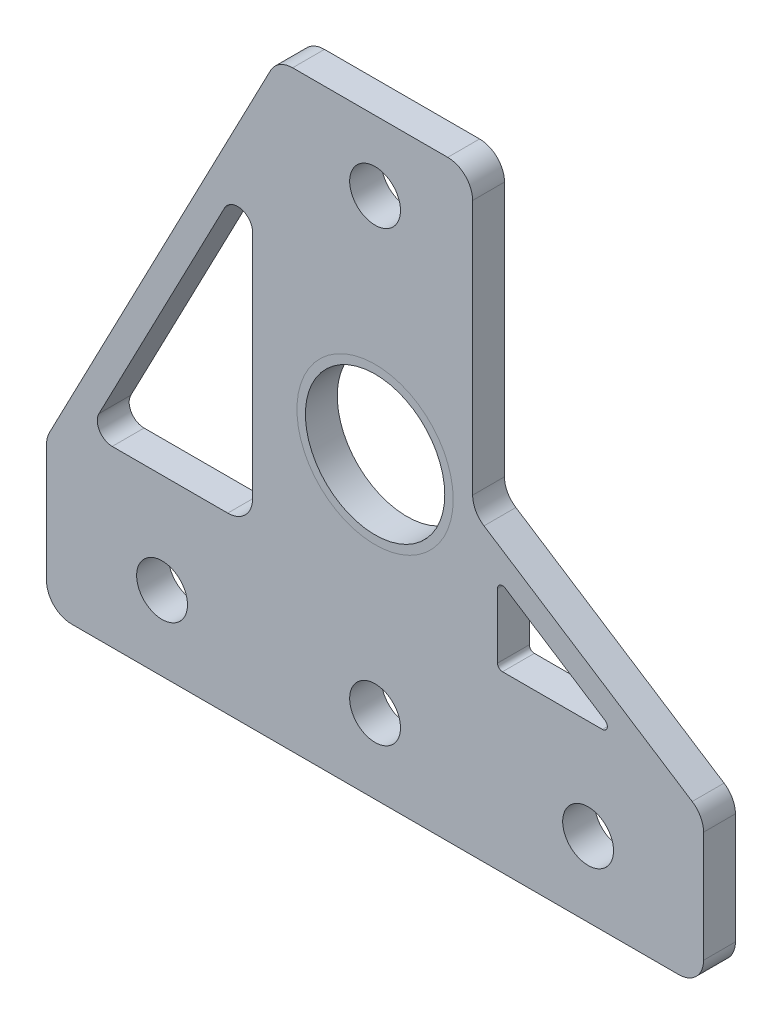
ISO-10303-21;
HEADER;
FILE_DESCRIPTION(('STEP AP214'),'2;1');
FILE_NAME('part.step','',(''),(''),'','','');
FILE_SCHEMA(('AUTOMOTIVE_DESIGN { 1 0 10303 214 1 1 1 1 }'));
ENDSEC;
DATA;
#1=APPLICATION_CONTEXT('core data for automotive mechanical design processes');
#2=APPLICATION_PROTOCOL_DEFINITION('international standard','automotive_design',2000,#1);
#3=PRODUCT_CONTEXT('',#1,'mechanical');
#4=PRODUCT('Part','Part','',(#3));
#5=PRODUCT_RELATED_PRODUCT_CATEGORY('part','',(#4));
#6=PRODUCT_DEFINITION_FORMATION('','',#4);
#7=PRODUCT_DEFINITION_CONTEXT('part definition',#1,'design');
#8=PRODUCT_DEFINITION('design','',#6,#7);
#9=PRODUCT_DEFINITION_SHAPE('','',#8);
#10=(LENGTH_UNIT() NAMED_UNIT(*) SI_UNIT(.MILLI.,.METRE.));
#11=(NAMED_UNIT(*) PLANE_ANGLE_UNIT() SI_UNIT($,.RADIAN.));
#12=(NAMED_UNIT(*) SI_UNIT($,.STERADIAN.) SOLID_ANGLE_UNIT());
#13=UNCERTAINTY_MEASURE_WITH_UNIT(LENGTH_MEASURE(1.E-05),#10,'distance_accuracy_value','');
#14=(GEOMETRIC_REPRESENTATION_CONTEXT(3) GLOBAL_UNCERTAINTY_ASSIGNED_CONTEXT((#13)) GLOBAL_UNIT_ASSIGNED_CONTEXT((#10,
#11,#12)) REPRESENTATION_CONTEXT('',''));
#15=CARTESIAN_POINT('',(0.,0.,0.));
#16=DIRECTION('',(0.,0.,1.));
#17=DIRECTION('',(1.,0.,0.));
#18=AXIS2_PLACEMENT_3D('',#15,#16,#17);
#19=CARTESIAN_POINT('',(0.,0.,0.));
#20=DIRECTION('',(0.,0.,-1.));
#21=DIRECTION('',(1.,0.,0.));
#22=AXIS2_PLACEMENT_3D('',#19,#20,#21);
#23=PLANE('',#22);
#24=DIRECTION('',(0.,-1.,0.));
#25=VECTOR('',#24,1.);
#26=CARTESIAN_POINT('',(-12.3,0.,0.));
#27=LINE('',#26,#25);
#28=CARTESIAN_POINT('',(-12.3,53.1750759692485,0.));
#29=VERTEX_POINT('',#28);
#30=CARTESIAN_POINT('',(-12.3,30.,0.));
#31=VERTEX_POINT('',#30);
#32=EDGE_CURVE('E459',#29,#31,#27,.T.);
#33=ORIENTED_EDGE('',*,*,#32,.T.);
#34=CARTESIAN_POINT('',(-14.8,30.,0.));
#35=DIRECTION('',(0.,0.,1.));
#36=DIRECTION('',(1.,0.,0.));
#37=AXIS2_PLACEMENT_3D('',#34,#35,#36);
#38=CIRCLE('',#37,2.5);
#39=CARTESIAN_POINT('',(-14.8,27.5,0.));
#40=VERTEX_POINT('',#39);
#41=EDGE_CURVE('E257',#40,#31,#38,.T.);
#42=ORIENTED_EDGE('',*,*,#41,.F.);
#43=DIRECTION('',(-1.,0.,0.));
#44=VECTOR('',#43,1.);
#45=CARTESIAN_POINT('',(0.,27.5,0.));
#46=LINE('',#45,#44);
#47=CARTESIAN_POINT('',(-26.4036351120577,27.5,0.));
#48=VERTEX_POINT('',#47);
#49=EDGE_CURVE('E244',#40,#48,#46,.T.);
#50=ORIENTED_EDGE('',*,*,#49,.T.);
#51=CARTESIAN_POINT('',(-26.4036351120577,29.,0.));
#52=DIRECTION('',(0.,0.,1.));
#53=DIRECTION('',(1.,0.,0.));
#54=AXIS2_PLACEMENT_3D('',#51,#52,#53);
#55=CIRCLE('',#54,1.5);
#56=CARTESIAN_POINT('',(-27.7337254989583,29.6934403814853,0.));
#57=VERTEX_POINT('',#56);
#58=EDGE_CURVE('E221',#57,#48,#55,.T.);
#59=ORIENTED_EDGE('',*,*,#58,.F.);
#60=DIRECTION('',(0.462293587656858,0.886726924600438,0.));
#61=VECTOR('',#60,1.);
#62=CARTESIAN_POINT('',(-33.9787800504102,17.7147797116745,0.));
#63=LINE('',#62,#61);
#64=CARTESIAN_POINT('',(-15.1300903869006,53.8685163507338,0.));
#65=VERTEX_POINT('',#64);
#66=EDGE_CURVE('E232',#57,#65,#63,.T.);
#67=ORIENTED_EDGE('',*,*,#66,.T.);
#68=CARTESIAN_POINT('',(-13.8,53.1750759692485,0.));
#69=DIRECTION('',(0.,0.,1.));
#70=DIRECTION('',(1.,0.,0.));
#71=AXIS2_PLACEMENT_3D('',#68,#69,#70);
#72=CIRCLE('',#71,1.5);
#73=EDGE_CURVE('E249',#29,#65,#72,.T.);
#74=ORIENTED_EDGE('',*,*,#73,.F.);
#75=EDGE_LOOP('',(#33,#42,#50,#59,#67,#74));
#76=FACE_BOUND('',#75,.T.);
#77=DIRECTION('',(0.,1.,0.));
#78=VECTOR('',#77,1.);
#79=CARTESIAN_POINT('',(12.3,0.,0.));
#80=LINE('',#79,#78);
#81=CARTESIAN_POINT('',(12.3,28.,0.));
#82=VERTEX_POINT('',#81);
#83=CARTESIAN_POINT('',(12.3,34.487913976209,0.));
#84=VERTEX_POINT('',#83);
#85=EDGE_CURVE('E369',#82,#84,#80,.T.);
#86=ORIENTED_EDGE('',*,*,#85,.T.);
#87=CARTESIAN_POINT('',(12.8,34.487913976209,0.));
#88=DIRECTION('',(0.,0.,1.));
#89=DIRECTION('',(1.,0.,0.));
#90=AXIS2_PLACEMENT_3D('',#87,#88,#89);
#91=CIRCLE('',#90,0.5);
#92=CARTESIAN_POINT('',(13.0714755376813,34.907796141156,0.));
#93=VERTEX_POINT('',#92);
#94=EDGE_CURVE('E287',#93,#84,#91,.T.);
#95=ORIENTED_EDGE('',*,*,#94,.F.);
#96=DIRECTION('',(-0.839764329894162,0.542951075362604,0.));
#97=VECTOR('',#96,1.);
#98=CARTESIAN_POINT('',(19.7696596786078,30.5770736362467,0.));
#99=LINE('',#98,#97);
#100=CARTESIAN_POINT('',(23.1061158208845,28.4198821649471,0.));
#101=VERTEX_POINT('',#100);
#102=EDGE_CURVE('E368',#101,#93,#99,.T.);
#103=ORIENTED_EDGE('',*,*,#102,.F.);
#104=CARTESIAN_POINT('',(22.8346402832032,28.,0.));
#105=DIRECTION('',(0.,0.,1.));
#106=DIRECTION('',(1.,0.,0.));
#107=AXIS2_PLACEMENT_3D('',#104,#105,#106);
#108=CIRCLE('',#107,0.5);
#109=CARTESIAN_POINT('',(22.8346402832032,27.5,0.));
#110=VERTEX_POINT('',#109);
#111=EDGE_CURVE('E281',#110,#101,#108,.T.);
#112=ORIENTED_EDGE('',*,*,#111,.F.);
#113=DIRECTION('',(1.,0.,0.));
#114=VECTOR('',#113,1.);
#115=CARTESIAN_POINT('',(0.,27.5,0.));
#116=LINE('',#115,#114);
#117=CARTESIAN_POINT('',(12.8,27.5,0.));
#118=VERTEX_POINT('',#117);
#119=EDGE_CURVE('E375',#118,#110,#116,.T.);
#120=ORIENTED_EDGE('',*,*,#119,.F.);
#121=CARTESIAN_POINT('',(12.8,28.,0.));
#122=DIRECTION('',(0.,0.,1.));
#123=DIRECTION('',(1.,0.,0.));
#124=AXIS2_PLACEMENT_3D('',#121,#122,#123);
#125=CIRCLE('',#124,0.5);
#126=EDGE_CURVE('E275',#82,#118,#125,.T.);
#127=ORIENTED_EDGE('',*,*,#126,.F.);
#128=EDGE_LOOP('',(#86,#95,#103,#112,#120,#127));
#129=FACE_BOUND('',#128,.T.);
#130=CARTESIAN_POINT('',(-21.4,17.5,0.));
#131=DIRECTION('',(0.,0.,1.));
#132=DIRECTION('',(1.,0.,0.));
#133=AXIS2_PLACEMENT_3D('',#130,#131,#132);
#134=CIRCLE('',#133,2.55270000000002);
#135=CARTESIAN_POINT('',(-18.8473,17.5,0.));
#136=VERTEX_POINT('',#135);
#137=EDGE_CURVE('E394',#136,#136,#134,.F.);
#138=ORIENTED_EDGE('',*,*,#137,.T.);
#139=EDGE_LOOP('',(#138));
#140=FACE_BOUND('',#139,.T.);
#141=CARTESIAN_POINT('',(21.4,17.5,0.));
#142=DIRECTION('',(0.,0.,1.));
#143=DIRECTION('',(1.,0.,0.));
#144=AXIS2_PLACEMENT_3D('',#141,#142,#143);
#145=CIRCLE('',#144,2.55270000000002);
#146=CARTESIAN_POINT('',(23.9527,17.5,0.));
#147=VERTEX_POINT('',#146);
#148=EDGE_CURVE('E397',#147,#147,#145,.F.);
#149=ORIENTED_EDGE('',*,*,#148,.T.);
#150=EDGE_LOOP('',(#149));
#151=FACE_BOUND('',#150,.T.);
#152=CARTESIAN_POINT('',(0.,17.5,0.));
#153=DIRECTION('',(0.,0.,1.));
#154=DIRECTION('',(1.,0.,0.));
#155=AXIS2_PLACEMENT_3D('',#152,#153,#154);
#156=CIRCLE('',#155,2.55270000000001);
#157=CARTESIAN_POINT('',(2.55269999999999,17.5,0.));
#158=VERTEX_POINT('',#157);
#159=EDGE_CURVE('E421',#158,#158,#156,.T.);
#160=ORIENTED_EDGE('',*,*,#159,.F.);
#161=EDGE_LOOP('',(#160));
#162=FACE_BOUND('',#161,.T.);
#163=CARTESIAN_POINT('',(0.,62.5,0.));
#164=DIRECTION('',(0.,0.,1.));
#165=DIRECTION('',(1.,0.,0.));
#166=AXIS2_PLACEMENT_3D('',#163,#164,#165);
#167=CIRCLE('',#166,2.55270000000001);
#168=CARTESIAN_POINT('',(2.5527,62.5,0.));
#169=VERTEX_POINT('',#168);
#170=EDGE_CURVE('E416',#169,#169,#167,.T.);
#171=ORIENTED_EDGE('',*,*,#170,.F.);
#172=EDGE_LOOP('',(#171));
#173=FACE_BOUND('',#172,.T.);
#174=DIRECTION('',(0.,-1.,0.));
#175=VECTOR('',#174,1.);
#176=CARTESIAN_POINT('',(-33.,0.,0.));
#177=LINE('',#176,#175);
#178=CARTESIAN_POINT('',(-33.,24.3874397221596,0.));
#179=VERTEX_POINT('',#178);
#180=CARTESIAN_POINT('',(-33.,12.5,0.));
#181=VERTEX_POINT('',#180);
#182=EDGE_CURVE('E398',#179,#181,#177,.T.);
#183=ORIENTED_EDGE('',*,*,#182,.T.);
#184=CARTESIAN_POINT('',(-30.5,12.5,0.));
#185=DIRECTION('',(0.,0.,1.));
#186=DIRECTION('',(1.,0.,0.));
#187=AXIS2_PLACEMENT_3D('',#184,#185,#186);
#188=CIRCLE('',#187,2.5);
#189=CARTESIAN_POINT('',(-30.5,10.,0.));
#190=VERTEX_POINT('',#189);
#191=EDGE_CURVE('E316',#190,#181,#188,.F.);
#192=ORIENTED_EDGE('',*,*,#191,.F.);
#193=DIRECTION('',(-1.,0.,0.));
#194=VECTOR('',#193,1.);
#195=CARTESIAN_POINT('',(0.,10.,0.));
#196=LINE('',#195,#194);
#197=CARTESIAN_POINT('',(30.5,10.,0.));
#198=VERTEX_POINT('',#197);
#199=EDGE_CURVE('E440',#198,#190,#196,.T.);
#200=ORIENTED_EDGE('',*,*,#199,.F.);
#201=CARTESIAN_POINT('',(30.5,12.5,0.));
#202=DIRECTION('',(0.,0.,1.));
#203=DIRECTION('',(1.,0.,0.));
#204=AXIS2_PLACEMENT_3D('',#201,#202,#203);
#205=CIRCLE('',#204,2.5);
#206=CARTESIAN_POINT('',(33.,12.5,0.));
#207=VERTEX_POINT('',#206);
#208=EDGE_CURVE('E314',#207,#198,#205,.F.);
#209=ORIENTED_EDGE('',*,*,#208,.F.);
#210=DIRECTION('',(0.,-1.,0.));
#211=VECTOR('',#210,1.);
#212=CARTESIAN_POINT('',(33.,0.,0.));
#213=LINE('',#212,#211);
#214=CARTESIAN_POINT('',(33.,23.6393536008638,0.));
#215=VERTEX_POINT('',#214);
#216=EDGE_CURVE('E408',#215,#207,#213,.T.);
#217=ORIENTED_EDGE('',*,*,#216,.F.);
#218=CARTESIAN_POINT('',(30.5,23.6393536008638,0.));
#219=DIRECTION('',(0.,0.,1.));
#220=DIRECTION('',(1.,0.,0.));
#221=AXIS2_PLACEMENT_3D('',#218,#219,#220);
#222=CIRCLE('',#221,2.5);
#223=CARTESIAN_POINT('',(31.8573776884065,25.7387644255992,0.));
#224=VERTEX_POINT('',#223);
#225=EDGE_CURVE('E324',#224,#215,#222,.F.);
#226=ORIENTED_EDGE('',*,*,#225,.F.);
#227=DIRECTION('',(-0.839764329894162,0.542951075362604,0.));
#228=VECTOR('',#227,1.);
#229=CARTESIAN_POINT('',(21.1270373670143,32.6764844609821,0.));
#230=LINE('',#229,#228);
#231=CARTESIAN_POINT('',(10.9426223115935,39.2612355744007,0.));
#232=VERTEX_POINT('',#231);
#233=EDGE_CURVE('E363',#224,#232,#230,.T.);
#234=ORIENTED_EDGE('',*,*,#233,.T.);
#235=CARTESIAN_POINT('',(12.3,41.3606463991361,0.));
#236=DIRECTION('',(0.,0.,1.));
#237=DIRECTION('',(1.,0.,0.));
#238=AXIS2_PLACEMENT_3D('',#235,#236,#237);
#239=CIRCLE('',#238,2.5);
#240=CARTESIAN_POINT('',(9.80000000000001,41.3606463991361,0.));
#241=VERTEX_POINT('',#240);
#242=EDGE_CURVE('E50',#241,#232,#239,.T.);
#243=ORIENTED_EDGE('',*,*,#242,.F.);
#244=DIRECTION('',(0.,1.,0.));
#245=VECTOR('',#244,1.);
#246=CARTESIAN_POINT('',(9.80000000000001,0.,0.));
#247=LINE('',#246,#245);
#248=CARTESIAN_POINT('',(9.80000000000001,67.,0.));
#249=VERTEX_POINT('',#248);
#250=EDGE_CURVE('E442',#241,#249,#247,.T.);
#251=ORIENTED_EDGE('',*,*,#250,.T.);
#252=CARTESIAN_POINT('',(7.30000000000001,67.,0.));
#253=DIRECTION('',(0.,0.,1.));
#254=DIRECTION('',(1.,0.,0.));
#255=AXIS2_PLACEMENT_3D('',#252,#253,#254);
#256=CIRCLE('',#255,2.5);
#257=CARTESIAN_POINT('',(7.30000000000001,69.5,0.));
#258=VERTEX_POINT('',#257);
#259=EDGE_CURVE('E321',#258,#249,#256,.F.);
#260=ORIENTED_EDGE('',*,*,#259,.F.);
#261=DIRECTION('',(-1.,0.,0.));
#262=VECTOR('',#261,1.);
#263=CARTESIAN_POINT('',(0.,69.5,0.));
#264=LINE('',#263,#262);
#265=CARTESIAN_POINT('',(-8.28401351806975,69.5,0.));
#266=VERTEX_POINT('',#265);
#267=EDGE_CURVE('E444',#258,#266,#264,.T.);
#268=ORIENTED_EDGE('',*,*,#267,.T.);
#269=CARTESIAN_POINT('',(-8.28401351806975,67.,0.));
#270=DIRECTION('',(0.,0.,1.));
#271=DIRECTION('',(1.,0.,0.));
#272=AXIS2_PLACEMENT_3D('',#269,#270,#271);
#273=CIRCLE('',#272,2.5);
#274=CARTESIAN_POINT('',(-10.5008308295708,68.1557339691422,0.));
#275=VERTEX_POINT('',#274);
#276=EDGE_CURVE('E318',#275,#266,#273,.F.);
#277=ORIENTED_EDGE('',*,*,#276,.F.);
#278=DIRECTION('',(0.462293587656858,0.886726924600438,0.));
#279=VECTOR('',#278,1.);
#280=CARTESIAN_POINT('',(-36.1955973619113,18.8705136808167,0.));
#281=LINE('',#280,#279);
#282=CARTESIAN_POINT('',(-32.7168173115011,25.5431736913018,0.));
#283=VERTEX_POINT('',#282);
#284=EDGE_CURVE('E386',#283,#275,#281,.T.);
#285=ORIENTED_EDGE('',*,*,#284,.F.);
#286=CARTESIAN_POINT('',(-30.5,24.3874397221596,0.));
#287=DIRECTION('',(0.,0.,1.));
#288=DIRECTION('',(1.,0.,0.));
#289=AXIS2_PLACEMENT_3D('',#286,#287,#288);
#290=CIRCLE('',#289,2.5);
#291=EDGE_CURVE('E327',#179,#283,#290,.F.);
#292=ORIENTED_EDGE('',*,*,#291,.F.);
#293=EDGE_LOOP('',(#183,#192,#200,#209,#217,#226,#234,#243,#251,#260,#268,#277,#285,#292));
#294=FACE_BOUND('',#293,.T.);
#295=CARTESIAN_POINT('',(0.,39.9999999999997,0.));
#296=DIRECTION('',(0.,0.,1.));
#297=DIRECTION('',(1.,0.,0.));
#298=AXIS2_PLACEMENT_3D('',#295,#296,#297);
#299=CIRCLE('',#298,7.84999999999999);
#300=CARTESIAN_POINT('',(7.85000000000007,39.9999999999997,0.));
#301=VERTEX_POINT('',#300);
#302=EDGE_CURVE('E11',#301,#301,#299,.F.);
#303=ORIENTED_EDGE('',*,*,#302,.T.);
#304=EDGE_LOOP('',(#303));
#305=FACE_BOUND('',#304,.T.);
#306=ADVANCED_FACE('F41',(#76,#129,#140,#151,#162,#173,#294,#305),#23,.F.);
#307=CARTESIAN_POINT('',(9.80000000000001,0.,-3.2));
#308=DIRECTION('',(-1.,0.,0.));
#309=DIRECTION('',(0.,0.,-1.));
#310=AXIS2_PLACEMENT_3D('',#307,#308,#309);
#311=PLANE('',#310);
#312=DIRECTION('',(0.,1.,0.));
#313=VECTOR('',#312,1.);
#314=CARTESIAN_POINT('',(9.80000000000001,0.,-3.2));
#315=LINE('',#314,#313);
#316=CARTESIAN_POINT('',(9.80000000000001,41.3606463991361,-3.2));
#317=VERTEX_POINT('',#316);
#318=CARTESIAN_POINT('',(9.80000000000001,67.,-3.2));
#319=VERTEX_POINT('',#318);
#320=EDGE_CURVE('E427',#317,#319,#315,.T.);
#321=ORIENTED_EDGE('',*,*,#320,.T.);
#322=DIRECTION('',(0.,0.,1.));
#323=VECTOR('',#322,1.);
#324=CARTESIAN_POINT('',(9.80000000000001,67.,-3.2));
#325=LINE('',#324,#323);
#326=EDGE_CURVE('E338',#249,#319,#325,.F.);
#327=ORIENTED_EDGE('',*,*,#326,.F.);
#328=ORIENTED_EDGE('',*,*,#250,.F.);
#329=DIRECTION('',(0.,0.,-1.));
#330=VECTOR('',#329,1.);
#331=CARTESIAN_POINT('',(9.80000000000001,41.3606463991361,0.));
#332=LINE('',#331,#330);
#333=EDGE_CURVE('E341',#317,#241,#332,.F.);
#334=ORIENTED_EDGE('',*,*,#333,.F.);
#335=EDGE_LOOP('',(#321,#327,#328,#334));
#336=FACE_BOUND('',#335,.T.);
#337=ADVANCED_FACE('F503',(#336),#311,.F.);
#338=CARTESIAN_POINT('',(0.,10.,-3.2));
#339=DIRECTION('',(0.,-1.,0.));
#340=DIRECTION('',(1.,0.,0.));
#341=AXIS2_PLACEMENT_3D('',#338,#339,#340);
#342=PLANE('',#341);
#343=DIRECTION('',(-1.,0.,0.));
#344=VECTOR('',#343,1.);
#345=CARTESIAN_POINT('',(0.,10.,-3.2));
#346=LINE('',#345,#344);
#347=CARTESIAN_POINT('',(30.5,10.,-3.2));
#348=VERTEX_POINT('',#347);
#349=CARTESIAN_POINT('',(-30.5,10.,-3.2));
#350=VERTEX_POINT('',#349);
#351=EDGE_CURVE('E424',#348,#350,#346,.T.);
#352=ORIENTED_EDGE('',*,*,#351,.F.);
#353=DIRECTION('',(0.,0.,-1.));
#354=VECTOR('',#353,1.);
#355=CARTESIAN_POINT('',(30.5,10.,-3.2));
#356=LINE('',#355,#354);
#357=EDGE_CURVE('E64',#198,#348,#356,.T.);
#358=ORIENTED_EDGE('',*,*,#357,.F.);
#359=ORIENTED_EDGE('',*,*,#199,.T.);
#360=DIRECTION('',(0.,0.,-1.));
#361=VECTOR('',#360,1.);
#362=CARTESIAN_POINT('',(-30.5,10.,0.));
#363=LINE('',#362,#361);
#364=EDGE_CURVE('E57',#350,#190,#363,.F.);
#365=ORIENTED_EDGE('',*,*,#364,.F.);
#366=EDGE_LOOP('',(#352,#358,#359,#365));
#367=FACE_BOUND('',#366,.T.);
#368=ADVANCED_FACE('F505',(#367),#342,.T.);
#369=CARTESIAN_POINT('',(0.,69.5,-3.2));
#370=DIRECTION('',(0.,-1.,0.));
#371=DIRECTION('',(0.,0.,1.));
#372=AXIS2_PLACEMENT_3D('',#369,#370,#371);
#373=PLANE('',#372);
#374=DIRECTION('',(-1.,0.,0.));
#375=VECTOR('',#374,1.);
#376=CARTESIAN_POINT('',(0.,69.5,-3.2));
#377=LINE('',#376,#375);
#378=CARTESIAN_POINT('',(7.30000000000001,69.5,-3.2));
#379=VERTEX_POINT('',#378);
#380=CARTESIAN_POINT('',(-8.28401351806975,69.5,-3.2));
#381=VERTEX_POINT('',#380);
#382=EDGE_CURVE('E430',#379,#381,#377,.T.);
#383=ORIENTED_EDGE('',*,*,#382,.T.);
#384=DIRECTION('',(0.,0.,1.));
#385=VECTOR('',#384,1.);
#386=CARTESIAN_POINT('',(-8.28401351806975,69.5,-3.2));
#387=LINE('',#386,#385);
#388=EDGE_CURVE('E343',#266,#381,#387,.F.);
#389=ORIENTED_EDGE('',*,*,#388,.F.);
#390=ORIENTED_EDGE('',*,*,#267,.F.);
#391=DIRECTION('',(0.,0.,1.));
#392=VECTOR('',#391,1.);
#393=CARTESIAN_POINT('',(7.30000000000001,69.5,-3.2));
#394=LINE('',#393,#392);
#395=EDGE_CURVE('E346',#379,#258,#394,.T.);
#396=ORIENTED_EDGE('',*,*,#395,.F.);
#397=EDGE_LOOP('',(#383,#389,#390,#396));
#398=FACE_BOUND('',#397,.T.);
#399=ADVANCED_FACE('F497',(#398),#373,.F.);
#400=CARTESIAN_POINT('',(0.,39.9999999999997,-3.2));
#401=DIRECTION('',(0.,0.,1.));
#402=DIRECTION('',(-1.,0.,0.));
#403=AXIS2_PLACEMENT_3D('',#400,#401,#402);
#404=CYLINDRICAL_SURFACE('',#403,7.00000000000001);
#405=CARTESIAN_POINT('',(0.,39.9999999999997,-3.2));
#406=DIRECTION('',(0.,0.,1.));
#407=DIRECTION('',(1.,0.,0.));
#408=AXIS2_PLACEMENT_3D('',#405,#406,#407);
#409=CIRCLE('',#408,7.00000000000001);
#410=CARTESIAN_POINT('',(7.00000000000009,39.9999999999997,-3.2));
#411=VERTEX_POINT('',#410);
#412=EDGE_CURVE('E420',#411,#411,#409,.T.);
#413=ORIENTED_EDGE('',*,*,#412,.F.);
#414=EDGE_LOOP('',(#413));
#415=FACE_BOUND('',#414,.T.);
#416=CARTESIAN_POINT('',(0.,39.9999999999997,0.));
#417=DIRECTION('',(0.,0.,1.));
#418=DIRECTION('',(1.,0.,0.));
#419=AXIS2_PLACEMENT_3D('',#416,#417,#418);
#420=CIRCLE('',#419,7.00000000000001);
#421=CARTESIAN_POINT('',(7.00000000000009,39.9999999999997,0.));
#422=VERTEX_POINT('',#421);
#423=EDGE_CURVE('E437',#422,#422,#420,.T.);
#424=ORIENTED_EDGE('',*,*,#423,.T.);
#425=EDGE_LOOP('',(#424));
#426=FACE_BOUND('',#425,.T.);
#427=ADVANCED_FACE('F517',(#415,#426),#404,.F.);
#428=CARTESIAN_POINT('',(0.,62.5,-3.2));
#429=DIRECTION('',(0.,0.,1.));
#430=DIRECTION('',(-1.,0.,0.));
#431=AXIS2_PLACEMENT_3D('',#428,#429,#430);
#432=CYLINDRICAL_SURFACE('',#431,2.55270000000001);
#433=CARTESIAN_POINT('',(0.,62.5,-3.2));
#434=DIRECTION('',(0.,0.,1.));
#435=DIRECTION('',(1.,0.,0.));
#436=AXIS2_PLACEMENT_3D('',#433,#434,#435);
#437=CIRCLE('',#436,2.55270000000001);
#438=CARTESIAN_POINT('',(2.5527,62.5,-3.2));
#439=VERTEX_POINT('',#438);
#440=EDGE_CURVE('E417',#439,#439,#437,.T.);
#441=ORIENTED_EDGE('',*,*,#440,.F.);
#442=EDGE_LOOP('',(#441));
#443=FACE_BOUND('',#442,.T.);
#444=ORIENTED_EDGE('',*,*,#170,.T.);
#445=EDGE_LOOP('',(#444));
#446=FACE_BOUND('',#445,.T.);
#447=ADVANCED_FACE('F520',(#443,#446),#432,.F.);
#448=CARTESIAN_POINT('',(0.,17.5,-3.2));
#449=DIRECTION('',(0.,0.,1.));
#450=DIRECTION('',(-1.,0.,0.));
#451=AXIS2_PLACEMENT_3D('',#448,#449,#450);
#452=CYLINDRICAL_SURFACE('',#451,2.55270000000001);
#453=CARTESIAN_POINT('',(0.,17.5,-3.2));
#454=DIRECTION('',(0.,0.,1.));
#455=DIRECTION('',(1.,0.,0.));
#456=AXIS2_PLACEMENT_3D('',#453,#454,#455);
#457=CIRCLE('',#456,2.55270000000001);
#458=CARTESIAN_POINT('',(2.55269999999999,17.5,-3.2));
#459=VERTEX_POINT('',#458);
#460=EDGE_CURVE('E229',#459,#459,#457,.T.);
#461=ORIENTED_EDGE('',*,*,#460,.F.);
#462=EDGE_LOOP('',(#461));
#463=FACE_BOUND('',#462,.T.);
#464=ORIENTED_EDGE('',*,*,#159,.T.);
#465=EDGE_LOOP('',(#464));
#466=FACE_BOUND('',#465,.T.);
#467=ADVANCED_FACE('F524',(#463,#466),#452,.F.);
#468=CARTESIAN_POINT('',(0.,0.,-3.2));
#469=DIRECTION('',(0.,0.,-1.));
#470=DIRECTION('',(1.,0.,0.));
#471=AXIS2_PLACEMENT_3D('',#468,#469,#470);
#472=PLANE('',#471);
#473=DIRECTION('',(-0.462293587656858,-0.886726924600438,0.));
#474=VECTOR('',#473,1.);
#475=CARTESIAN_POINT('',(-36.1955973619113,18.8705136808167,-3.2));
#476=LINE('',#475,#474);
#477=CARTESIAN_POINT('',(-10.5008308295708,68.1557339691421,-3.2));
#478=VERTEX_POINT('',#477);
#479=CARTESIAN_POINT('',(-32.7168173115011,25.5431736913018,-3.2));
#480=VERTEX_POINT('',#479);
#481=EDGE_CURVE('E471',#478,#480,#476,.T.);
#482=ORIENTED_EDGE('',*,*,#481,.F.);
#483=CARTESIAN_POINT('',(-8.28401351806975,67.,-3.2));
#484=DIRECTION('',(0.,0.,1.));
#485=DIRECTION('',(1.,0.,0.));
#486=AXIS2_PLACEMENT_3D('',#483,#484,#485);
#487=CIRCLE('',#486,2.5);
#488=EDGE_CURVE('E299',#381,#478,#487,.T.);
#489=ORIENTED_EDGE('',*,*,#488,.F.);
#490=ORIENTED_EDGE('',*,*,#382,.F.);
#491=CARTESIAN_POINT('',(7.30000000000001,67.,-3.2));
#492=DIRECTION('',(0.,0.,1.));
#493=DIRECTION('',(1.,0.,0.));
#494=AXIS2_PLACEMENT_3D('',#491,#492,#493);
#495=CIRCLE('',#494,2.5);
#496=EDGE_CURVE('E302',#319,#379,#495,.T.);
#497=ORIENTED_EDGE('',*,*,#496,.F.);
#498=ORIENTED_EDGE('',*,*,#320,.F.);
#499=CARTESIAN_POINT('',(12.3,41.3606463991361,-3.2));
#500=DIRECTION('',(0.,0.,1.));
#501=DIRECTION('',(1.,0.,0.));
#502=AXIS2_PLACEMENT_3D('',#499,#500,#501);
#503=CIRCLE('',#502,2.5);
#504=CARTESIAN_POINT('',(10.9426223115935,39.2612355744007,-3.2));
#505=VERTEX_POINT('',#504);
#506=EDGE_CURVE('E350',#505,#317,#503,.F.);
#507=ORIENTED_EDGE('',*,*,#506,.F.);
#508=DIRECTION('',(0.839764329894162,-0.542951075362604,0.));
#509=VECTOR('',#508,1.);
#510=CARTESIAN_POINT('',(21.1270373670143,32.6764844609821,-3.2));
#511=LINE('',#510,#509);
#512=CARTESIAN_POINT('',(31.8573776884065,25.7387644255992,-3.2));
#513=VERTEX_POINT('',#512);
#514=EDGE_CURVE('E380',#505,#513,#511,.T.);
#515=ORIENTED_EDGE('',*,*,#514,.T.);
#516=CARTESIAN_POINT('',(30.5,23.6393536008638,-3.2));
#517=DIRECTION('',(0.,0.,1.));
#518=DIRECTION('',(1.,0.,0.));
#519=AXIS2_PLACEMENT_3D('',#516,#517,#518);
#520=CIRCLE('',#519,2.5);
#521=CARTESIAN_POINT('',(33.,23.6393536008638,-3.2));
#522=VERTEX_POINT('',#521);
#523=EDGE_CURVE('E304',#522,#513,#520,.T.);
#524=ORIENTED_EDGE('',*,*,#523,.F.);
#525=DIRECTION('',(0.,1.,0.));
#526=VECTOR('',#525,1.);
#527=CARTESIAN_POINT('',(33.,0.,-3.2));
#528=LINE('',#527,#526);
#529=CARTESIAN_POINT('',(33.,12.5,-3.2));
#530=VERTEX_POINT('',#529);
#531=EDGE_CURVE('E405',#530,#522,#528,.T.);
#532=ORIENTED_EDGE('',*,*,#531,.F.);
#533=CARTESIAN_POINT('',(30.5,12.5,-3.2));
#534=DIRECTION('',(0.,0.,1.));
#535=DIRECTION('',(1.,0.,0.));
#536=AXIS2_PLACEMENT_3D('',#533,#534,#535);
#537=CIRCLE('',#536,2.5);
#538=EDGE_CURVE('E294',#348,#530,#537,.T.);
#539=ORIENTED_EDGE('',*,*,#538,.F.);
#540=ORIENTED_EDGE('',*,*,#351,.T.);
#541=CARTESIAN_POINT('',(-30.5,12.5,-3.2));
#542=DIRECTION('',(0.,0.,1.));
#543=DIRECTION('',(1.,0.,0.));
#544=AXIS2_PLACEMENT_3D('',#541,#542,#543);
#545=CIRCLE('',#544,2.5);
#546=CARTESIAN_POINT('',(-33.,12.5,-3.2));
#547=VERTEX_POINT('',#546);
#548=EDGE_CURVE('E297',#547,#350,#545,.T.);
#549=ORIENTED_EDGE('',*,*,#548,.F.);
#550=DIRECTION('',(0.,1.,0.));
#551=VECTOR('',#550,1.);
#552=CARTESIAN_POINT('',(-33.,0.,-3.2));
#553=LINE('',#552,#551);
#554=CARTESIAN_POINT('',(-33.,24.3874397221596,-3.2));
#555=VERTEX_POINT('',#554);
#556=EDGE_CURVE('E401',#547,#555,#553,.T.);
#557=ORIENTED_EDGE('',*,*,#556,.T.);
#558=CARTESIAN_POINT('',(-30.5,24.3874397221596,-3.2));
#559=DIRECTION('',(0.,0.,1.));
#560=DIRECTION('',(1.,0.,0.));
#561=AXIS2_PLACEMENT_3D('',#558,#559,#560);
#562=CIRCLE('',#561,2.5);
#563=EDGE_CURVE('E307',#480,#555,#562,.T.);
#564=ORIENTED_EDGE('',*,*,#563,.F.);
#565=EDGE_LOOP('',(#482,#489,#490,#497,#498,#507,#515,#524,#532,#539,#540,#549,#557,#564));
#566=FACE_BOUND('',#565,.T.);
#567=ORIENTED_EDGE('',*,*,#440,.T.);
#568=EDGE_LOOP('',(#567));
#569=FACE_BOUND('',#568,.T.);
#570=ORIENTED_EDGE('',*,*,#412,.T.);
#571=EDGE_LOOP('',(#570));
#572=FACE_BOUND('',#571,.T.);
#573=ORIENTED_EDGE('',*,*,#460,.T.);
#574=EDGE_LOOP('',(#573));
#575=FACE_BOUND('',#574,.T.);
#576=CARTESIAN_POINT('',(21.4,17.5,-3.2));
#577=DIRECTION('',(0.,0.,1.));
#578=DIRECTION('',(1.,0.,0.));
#579=AXIS2_PLACEMENT_3D('',#576,#577,#578);
#580=CIRCLE('',#579,2.55270000000002);
#581=CARTESIAN_POINT('',(23.9527,17.5,-3.2));
#582=VERTEX_POINT('',#581);
#583=EDGE_CURVE('E409',#582,#582,#580,.T.);
#584=ORIENTED_EDGE('',*,*,#583,.T.);
#585=EDGE_LOOP('',(#584));
#586=FACE_BOUND('',#585,.T.);
#587=CARTESIAN_POINT('',(-21.4,17.5,-3.2));
#588=DIRECTION('',(0.,0.,1.));
#589=DIRECTION('',(1.,0.,0.));
#590=AXIS2_PLACEMENT_3D('',#587,#588,#589);
#591=CIRCLE('',#590,2.55270000000002);
#592=CARTESIAN_POINT('',(-18.8473,17.5,-3.2));
#593=VERTEX_POINT('',#592);
#594=EDGE_CURVE('E372',#593,#593,#591,.T.);
#595=ORIENTED_EDGE('',*,*,#594,.T.);
#596=EDGE_LOOP('',(#595));
#597=FACE_BOUND('',#596,.T.);
#598=DIRECTION('',(0.,-1.,0.));
#599=VECTOR('',#598,1.);
#600=CARTESIAN_POINT('',(12.3,0.,-3.2));
#601=LINE('',#600,#599);
#602=CARTESIAN_POINT('',(12.3,34.487913976209,-3.2));
#603=VERTEX_POINT('',#602);
#604=CARTESIAN_POINT('',(12.3,28.,-3.2));
#605=VERTEX_POINT('',#604);
#606=EDGE_CURVE('E382',#603,#605,#601,.T.);
#607=ORIENTED_EDGE('',*,*,#606,.T.);
#608=CARTESIAN_POINT('',(12.8,28.,-3.2));
#609=DIRECTION('',(0.,0.,1.));
#610=DIRECTION('',(1.,0.,0.));
#611=AXIS2_PLACEMENT_3D('',#608,#609,#610);
#612=CIRCLE('',#611,0.5);
#613=CARTESIAN_POINT('',(12.8,27.5,-3.2));
#614=VERTEX_POINT('',#613);
#615=EDGE_CURVE('E272',#614,#605,#612,.F.);
#616=ORIENTED_EDGE('',*,*,#615,.F.);
#617=DIRECTION('',(-1.,0.,0.));
#618=VECTOR('',#617,1.);
#619=CARTESIAN_POINT('',(0.,27.5,-3.2));
#620=LINE('',#619,#618);
#621=CARTESIAN_POINT('',(22.8346402832032,27.5,-3.2));
#622=VERTEX_POINT('',#621);
#623=EDGE_CURVE('E389',#622,#614,#620,.T.);
#624=ORIENTED_EDGE('',*,*,#623,.F.);
#625=CARTESIAN_POINT('',(22.8346402832032,28.,-3.2));
#626=DIRECTION('',(0.,0.,1.));
#627=DIRECTION('',(1.,0.,0.));
#628=AXIS2_PLACEMENT_3D('',#625,#626,#627);
#629=CIRCLE('',#628,0.5);
#630=CARTESIAN_POINT('',(23.1061158208845,28.4198821649471,-3.2));
#631=VERTEX_POINT('',#630);
#632=EDGE_CURVE('E278',#631,#622,#629,.F.);
#633=ORIENTED_EDGE('',*,*,#632,.F.);
#634=DIRECTION('',(0.839764329894162,-0.542951075362604,0.));
#635=VECTOR('',#634,1.);
#636=CARTESIAN_POINT('',(19.7696596786078,30.5770736362467,-3.2));
#637=LINE('',#636,#635);
#638=CARTESIAN_POINT('',(13.0714755376813,34.907796141156,-3.2));
#639=VERTEX_POINT('',#638);
#640=EDGE_CURVE('E385',#639,#631,#637,.T.);
#641=ORIENTED_EDGE('',*,*,#640,.F.);
#642=CARTESIAN_POINT('',(12.8,34.487913976209,-3.2));
#643=DIRECTION('',(0.,0.,1.));
#644=DIRECTION('',(1.,0.,0.));
#645=AXIS2_PLACEMENT_3D('',#642,#643,#644);
#646=CIRCLE('',#645,0.5);
#647=EDGE_CURVE('E284',#603,#639,#646,.F.);
#648=ORIENTED_EDGE('',*,*,#647,.F.);
#649=EDGE_LOOP('',(#607,#616,#624,#633,#641,#648));
#650=FACE_BOUND('',#649,.T.);
#651=DIRECTION('',(1.,0.,0.));
#652=VECTOR('',#651,1.);
#653=CARTESIAN_POINT('',(0.,27.5,-3.2));
#654=LINE('',#653,#652);
#655=CARTESIAN_POINT('',(-26.4036351120577,27.5,-3.2));
#656=VERTEX_POINT('',#655);
#657=CARTESIAN_POINT('',(-14.8,27.5,-3.2));
#658=VERTEX_POINT('',#657);
#659=EDGE_CURVE('E463',#656,#658,#654,.T.);
#660=ORIENTED_EDGE('',*,*,#659,.T.);
#661=CARTESIAN_POINT('',(-14.8,30.,-3.2));
#662=DIRECTION('',(0.,0.,1.));
#663=DIRECTION('',(1.,0.,0.));
#664=AXIS2_PLACEMENT_3D('',#661,#662,#663);
#665=CIRCLE('',#664,2.5);
#666=CARTESIAN_POINT('',(-12.3,30.,-3.2));
#667=VERTEX_POINT('',#666);
#668=EDGE_CURVE('E254',#667,#658,#665,.F.);
#669=ORIENTED_EDGE('',*,*,#668,.F.);
#670=DIRECTION('',(0.,1.,0.));
#671=VECTOR('',#670,1.);
#672=CARTESIAN_POINT('',(-12.3,0.,-3.2));
#673=LINE('',#672,#671);
#674=CARTESIAN_POINT('',(-12.3,53.1750759692485,-3.2));
#675=VERTEX_POINT('',#674);
#676=EDGE_CURVE('E238',#667,#675,#673,.T.);
#677=ORIENTED_EDGE('',*,*,#676,.T.);
#678=CARTESIAN_POINT('',(-13.8,53.1750759692485,-3.2));
#679=DIRECTION('',(0.,0.,1.));
#680=DIRECTION('',(1.,0.,0.));
#681=AXIS2_PLACEMENT_3D('',#678,#679,#680);
#682=CIRCLE('',#681,1.5);
#683=CARTESIAN_POINT('',(-15.1300903869006,53.8685163507338,-3.2));
#684=VERTEX_POINT('',#683);
#685=EDGE_CURVE('E454',#684,#675,#682,.F.);
#686=ORIENTED_EDGE('',*,*,#685,.F.);
#687=DIRECTION('',(-0.462293587656858,-0.886726924600438,0.));
#688=VECTOR('',#687,1.);
#689=CARTESIAN_POINT('',(-33.9787800504102,17.7147797116745,-3.2));
#690=LINE('',#689,#688);
#691=CARTESIAN_POINT('',(-27.7337254989583,29.6934403814853,-3.2));
#692=VERTEX_POINT('',#691);
#693=EDGE_CURVE('E237',#684,#692,#690,.T.);
#694=ORIENTED_EDGE('',*,*,#693,.T.);
#695=CARTESIAN_POINT('',(-26.4036351120577,29.,-3.2));
#696=DIRECTION('',(0.,0.,1.));
#697=DIRECTION('',(1.,0.,0.));
#698=AXIS2_PLACEMENT_3D('',#695,#696,#697);
#699=CIRCLE('',#698,1.5);
#700=EDGE_CURVE('E224',#656,#692,#699,.F.);
#701=ORIENTED_EDGE('',*,*,#700,.F.);
#702=EDGE_LOOP('',(#660,#669,#677,#686,#694,#701));
#703=FACE_BOUND('',#702,.T.);
#704=ADVANCED_FACE('F480',(#566,#569,#572,#575,#586,#597,#650,#703),#472,.T.);
#705=ORIENTED_EDGE('',*,*,#302,.F.);
#706=EDGE_LOOP('',(#705));
#707=FACE_BOUND('',#706,.T.);
#708=ORIENTED_EDGE('',*,*,#423,.F.);
#709=EDGE_LOOP('',(#708));
#710=FACE_BOUND('',#709,.T.);
#711=ADVANCED_FACE('F513',(#707,#710),#23,.F.);
#712=CARTESIAN_POINT('',(33.,0.,27.6267985839837));
#713=DIRECTION('',(1.,0.,0.));
#714=DIRECTION('',(0.,0.,1.));
#715=AXIS2_PLACEMENT_3D('',#712,#713,#714);
#716=PLANE('',#715);
#717=ORIENTED_EDGE('',*,*,#216,.T.);
#718=DIRECTION('',(0.,0.,-1.));
#719=VECTOR('',#718,1.);
#720=CARTESIAN_POINT('',(33.,12.5,27.6267985839837));
#721=LINE('',#720,#719);
#722=EDGE_CURVE('E330',#530,#207,#721,.F.);
#723=ORIENTED_EDGE('',*,*,#722,.F.);
#724=ORIENTED_EDGE('',*,*,#531,.T.);
#725=DIRECTION('',(0.,0.,-1.));
#726=VECTOR('',#725,1.);
#727=CARTESIAN_POINT('',(33.,23.6393536008638,-3.2));
#728=LINE('',#727,#726);
#729=EDGE_CURVE('E332',#215,#522,#728,.T.);
#730=ORIENTED_EDGE('',*,*,#729,.F.);
#731=EDGE_LOOP('',(#717,#723,#724,#730));
#732=FACE_BOUND('',#731,.T.);
#733=ADVANCED_FACE('F570',(#732),#716,.T.);
#734=CARTESIAN_POINT('',(21.4,17.5,27.6267985839837));
#735=DIRECTION('',(0.,0.,-1.));
#736=DIRECTION('',(1.,0.,0.));
#737=AXIS2_PLACEMENT_3D('',#734,#735,#736);
#738=CYLINDRICAL_SURFACE('',#737,2.55270000000002);
#739=ORIENTED_EDGE('',*,*,#148,.F.);
#740=EDGE_LOOP('',(#739));
#741=FACE_BOUND('',#740,.T.);
#742=ORIENTED_EDGE('',*,*,#583,.F.);
#743=EDGE_LOOP('',(#742));
#744=FACE_BOUND('',#743,.T.);
#745=ADVANCED_FACE('F600',(#741,#744),#738,.F.);
#746=CARTESIAN_POINT('',(-21.4,17.5,27.6267985839837));
#747=DIRECTION('',(0.,0.,-1.));
#748=DIRECTION('',(1.,0.,0.));
#749=AXIS2_PLACEMENT_3D('',#746,#747,#748);
#750=CYLINDRICAL_SURFACE('',#749,2.55270000000002);
#751=ORIENTED_EDGE('',*,*,#137,.F.);
#752=EDGE_LOOP('',(#751));
#753=FACE_BOUND('',#752,.T.);
#754=ORIENTED_EDGE('',*,*,#594,.F.);
#755=EDGE_LOOP('',(#754));
#756=FACE_BOUND('',#755,.T.);
#757=ADVANCED_FACE('F597',(#753,#756),#750,.F.);
#758=CARTESIAN_POINT('',(-33.,0.,27.6267985839837));
#759=DIRECTION('',(1.,0.,0.));
#760=DIRECTION('',(0.,1.,0.));
#761=AXIS2_PLACEMENT_3D('',#758,#759,#760);
#762=PLANE('',#761);
#763=ORIENTED_EDGE('',*,*,#556,.F.);
#764=DIRECTION('',(0.,0.,-1.));
#765=VECTOR('',#764,1.);
#766=CARTESIAN_POINT('',(-33.,12.5,-3.2));
#767=LINE('',#766,#765);
#768=EDGE_CURVE('E310',#181,#547,#767,.T.);
#769=ORIENTED_EDGE('',*,*,#768,.F.);
#770=ORIENTED_EDGE('',*,*,#182,.F.);
#771=DIRECTION('',(0.,0.,-1.));
#772=VECTOR('',#771,1.);
#773=CARTESIAN_POINT('',(-33.,24.3874397221596,0.));
#774=LINE('',#773,#772);
#775=EDGE_CURVE('E312',#555,#179,#774,.F.);
#776=ORIENTED_EDGE('',*,*,#775,.F.);
#777=EDGE_LOOP('',(#763,#769,#770,#776));
#778=FACE_BOUND('',#777,.T.);
#779=ADVANCED_FACE('F566',(#778),#762,.F.);
#780=CARTESIAN_POINT('',(19.7696596786078,30.5770736362467,50.1845593783586));
#781=DIRECTION('',(-0.542951075362604,-0.839764329894162,0.));
#782=DIRECTION('',(0.839764329894162,-0.542951075362604,0.));
#783=AXIS2_PLACEMENT_3D('',#780,#781,#782);
#784=PLANE('',#783);
#785=ORIENTED_EDGE('',*,*,#102,.T.);
#786=DIRECTION('',(0.,0.,-1.));
#787=VECTOR('',#786,1.);
#788=CARTESIAN_POINT('',(13.0714755376813,34.907796141156,50.1845593783586));
#789=LINE('',#788,#787);
#790=EDGE_CURVE('E268',#639,#93,#789,.F.);
#791=ORIENTED_EDGE('',*,*,#790,.F.);
#792=ORIENTED_EDGE('',*,*,#640,.T.);
#793=DIRECTION('',(0.,0.,-1.));
#794=VECTOR('',#793,1.);
#795=CARTESIAN_POINT('',(23.1061158208845,28.4198821649471,-3.2));
#796=LINE('',#795,#794);
#797=EDGE_CURVE('E270',#101,#631,#796,.T.);
#798=ORIENTED_EDGE('',*,*,#797,.F.);
#799=EDGE_LOOP('',(#785,#791,#792,#798));
#800=FACE_BOUND('',#799,.T.);
#801=ADVANCED_FACE('F590',(#800),#784,.T.);
#802=CARTESIAN_POINT('',(0.,27.5,50.1845593783586));
#803=DIRECTION('',(0.,1.,0.));
#804=DIRECTION('',(-1.,0.,0.));
#805=AXIS2_PLACEMENT_3D('',#802,#803,#804);
#806=PLANE('',#805);
#807=ORIENTED_EDGE('',*,*,#119,.T.);
#808=DIRECTION('',(0.,0.,-1.));
#809=VECTOR('',#808,1.);
#810=CARTESIAN_POINT('',(22.8346402832032,27.5,0.));
#811=LINE('',#810,#809);
#812=EDGE_CURVE('E260',#622,#110,#811,.F.);
#813=ORIENTED_EDGE('',*,*,#812,.F.);
#814=ORIENTED_EDGE('',*,*,#623,.T.);
#815=DIRECTION('',(0.,0.,-1.));
#816=VECTOR('',#815,1.);
#817=CARTESIAN_POINT('',(12.8,27.5,50.1845593783586));
#818=LINE('',#817,#816);
#819=EDGE_CURVE('E262',#118,#614,#818,.T.);
#820=ORIENTED_EDGE('',*,*,#819,.F.);
#821=EDGE_LOOP('',(#807,#813,#814,#820));
#822=FACE_BOUND('',#821,.T.);
#823=ADVANCED_FACE('F583',(#822),#806,.T.);
#824=CARTESIAN_POINT('',(12.3,0.,50.1845593783586));
#825=DIRECTION('',(-1.,0.,0.));
#826=DIRECTION('',(0.,-1.,0.));
#827=AXIS2_PLACEMENT_3D('',#824,#825,#826);
#828=PLANE('',#827);
#829=ORIENTED_EDGE('',*,*,#606,.F.);
#830=DIRECTION('',(0.,0.,-1.));
#831=VECTOR('',#830,1.);
#832=CARTESIAN_POINT('',(12.3,34.487913976209,50.1845593783586));
#833=LINE('',#832,#831);
#834=EDGE_CURVE('E264',#84,#603,#833,.T.);
#835=ORIENTED_EDGE('',*,*,#834,.F.);
#836=ORIENTED_EDGE('',*,*,#85,.F.);
#837=DIRECTION('',(0.,0.,-1.));
#838=VECTOR('',#837,1.);
#839=CARTESIAN_POINT('',(12.3,28.,50.1845593783586));
#840=LINE('',#839,#838);
#841=EDGE_CURVE('E266',#605,#82,#840,.F.);
#842=ORIENTED_EDGE('',*,*,#841,.F.);
#843=EDGE_LOOP('',(#829,#835,#836,#842));
#844=FACE_BOUND('',#843,.T.);
#845=ADVANCED_FACE('F575',(#844),#828,.F.);
#846=CARTESIAN_POINT('',(21.1270373670143,32.6764844609821,50.1845593783586));
#847=DIRECTION('',(-0.542951075362604,-0.839764329894162,0.));
#848=DIRECTION('',(0.839764329894162,-0.542951075362604,0.));
#849=AXIS2_PLACEMENT_3D('',#846,#847,#848);
#850=PLANE('',#849);
#851=ORIENTED_EDGE('',*,*,#514,.F.);
#852=DIRECTION('',(0.,0.,-1.));
#853=VECTOR('',#852,1.);
#854=CARTESIAN_POINT('',(10.9426223115935,39.2612355744007,-3.2));
#855=LINE('',#854,#853);
#856=EDGE_CURVE('E334',#232,#505,#855,.T.);
#857=ORIENTED_EDGE('',*,*,#856,.F.);
#858=ORIENTED_EDGE('',*,*,#233,.F.);
#859=DIRECTION('',(0.,0.,-1.));
#860=VECTOR('',#859,1.);
#861=CARTESIAN_POINT('',(31.8573776884065,25.7387644255992,0.));
#862=LINE('',#861,#860);
#863=EDGE_CURVE('E336',#513,#224,#862,.F.);
#864=ORIENTED_EDGE('',*,*,#863,.F.);
#865=EDGE_LOOP('',(#851,#857,#858,#864));
#866=FACE_BOUND('',#865,.T.);
#867=ADVANCED_FACE('F572',(#866),#850,.F.);
#868=CARTESIAN_POINT('',(0.,27.5,50.1845593783586));
#869=DIRECTION('',(0.,-1.,0.));
#870=DIRECTION('',(0.,0.,1.));
#871=AXIS2_PLACEMENT_3D('',#868,#869,#870);
#872=PLANE('',#871);
#873=ORIENTED_EDGE('',*,*,#659,.F.);
#874=DIRECTION('',(0.,0.,-1.));
#875=VECTOR('',#874,1.);
#876=CARTESIAN_POINT('',(-26.4036351120577,27.5,-3.2));
#877=LINE('',#876,#875);
#878=EDGE_CURVE('E452',#48,#656,#877,.T.);
#879=ORIENTED_EDGE('',*,*,#878,.F.);
#880=ORIENTED_EDGE('',*,*,#49,.F.);
#881=DIRECTION('',(0.,0.,-1.));
#882=VECTOR('',#881,1.);
#883=CARTESIAN_POINT('',(-14.8,27.5,0.));
#884=LINE('',#883,#882);
#885=EDGE_CURVE('E247',#658,#40,#884,.F.);
#886=ORIENTED_EDGE('',*,*,#885,.F.);
#887=EDGE_LOOP('',(#873,#879,#880,#886));
#888=FACE_BOUND('',#887,.T.);
#889=ADVANCED_FACE('F574',(#888),#872,.F.);
#890=CARTESIAN_POINT('',(-12.3,0.,50.1845593783586));
#891=DIRECTION('',(1.,0.,0.));
#892=DIRECTION('',(0.,0.,1.));
#893=AXIS2_PLACEMENT_3D('',#890,#891,#892);
#894=PLANE('',#893);
#895=ORIENTED_EDGE('',*,*,#32,.F.);
#896=DIRECTION('',(0.,0.,-1.));
#897=VECTOR('',#896,1.);
#898=CARTESIAN_POINT('',(-12.3,53.1750759692485,0.));
#899=LINE('',#898,#897);
#900=EDGE_CURVE('E450',#675,#29,#899,.F.);
#901=ORIENTED_EDGE('',*,*,#900,.F.);
#902=ORIENTED_EDGE('',*,*,#676,.F.);
#903=DIRECTION('',(0.,0.,-1.));
#904=VECTOR('',#903,1.);
#905=CARTESIAN_POINT('',(-12.3,30.,-3.2));
#906=LINE('',#905,#904);
#907=EDGE_CURVE('E245',#31,#667,#906,.T.);
#908=ORIENTED_EDGE('',*,*,#907,.F.);
#909=EDGE_LOOP('',(#895,#901,#902,#908));
#910=FACE_BOUND('',#909,.T.);
#911=ADVANCED_FACE('F461',(#910),#894,.F.);
#912=CARTESIAN_POINT('',(-33.9787800504102,17.7147797116745,50.1845593783586));
#913=DIRECTION('',(-0.886726924600438,0.462293587656858,0.));
#914=DIRECTION('',(-0.462293587656858,-0.886726924600438,0.));
#915=AXIS2_PLACEMENT_3D('',#912,#913,#914);
#916=PLANE('',#915);
#917=ORIENTED_EDGE('',*,*,#66,.F.);
#918=DIRECTION('',(0.,0.,-1.));
#919=VECTOR('',#918,1.);
#920=CARTESIAN_POINT('',(-27.7337254989583,29.6934403814853,0.));
#921=LINE('',#920,#919);
#922=EDGE_CURVE('E217',#692,#57,#921,.F.);
#923=ORIENTED_EDGE('',*,*,#922,.F.);
#924=ORIENTED_EDGE('',*,*,#693,.F.);
#925=DIRECTION('',(0.,0.,-1.));
#926=VECTOR('',#925,1.);
#927=CARTESIAN_POINT('',(-15.1300903869006,53.8685163507338,-3.19999999999999));
#928=LINE('',#927,#926);
#929=EDGE_CURVE('E228',#65,#684,#928,.T.);
#930=ORIENTED_EDGE('',*,*,#929,.F.);
#931=EDGE_LOOP('',(#917,#923,#924,#930));
#932=FACE_BOUND('',#931,.T.);
#933=ADVANCED_FACE('F233',(#932),#916,.F.);
#934=CARTESIAN_POINT('',(-36.1955973619113,18.8705136808167,50.1845593783586));
#935=DIRECTION('',(-0.886726924600438,0.462293587656858,0.));
#936=DIRECTION('',(-0.462293587656858,-0.886726924600438,0.));
#937=AXIS2_PLACEMENT_3D('',#934,#935,#936);
#938=PLANE('',#937);
#939=ORIENTED_EDGE('',*,*,#284,.T.);
#940=DIRECTION('',(0.,0.,1.));
#941=VECTOR('',#940,1.);
#942=CARTESIAN_POINT('',(-10.5008308295708,68.1557339691421,0.));
#943=LINE('',#942,#941);
#944=EDGE_CURVE('E290',#478,#275,#943,.T.);
#945=ORIENTED_EDGE('',*,*,#944,.F.);
#946=ORIENTED_EDGE('',*,*,#481,.T.);
#947=DIRECTION('',(0.,0.,-1.));
#948=VECTOR('',#947,1.);
#949=CARTESIAN_POINT('',(-32.7168173115011,25.5431736913018,-3.2));
#950=LINE('',#949,#948);
#951=EDGE_CURVE('E292',#283,#480,#950,.T.);
#952=ORIENTED_EDGE('',*,*,#951,.F.);
#953=EDGE_LOOP('',(#939,#945,#946,#952));
#954=FACE_BOUND('',#953,.T.);
#955=ADVANCED_FACE('F477',(#954),#938,.T.);
#956=CARTESIAN_POINT('',(-13.8,53.1750759692485,50.1845593783586));
#957=DIRECTION('',(0.,0.,1.));
#958=DIRECTION('',(-1.,0.,0.));
#959=AXIS2_PLACEMENT_3D('',#956,#957,#958);
#960=CYLINDRICAL_SURFACE('',#959,1.5);
#961=ORIENTED_EDGE('',*,*,#73,.T.);
#962=ORIENTED_EDGE('',*,*,#929,.T.);
#963=ORIENTED_EDGE('',*,*,#685,.T.);
#964=ORIENTED_EDGE('',*,*,#900,.T.);
#965=EDGE_LOOP('',(#961,#962,#963,#964));
#966=FACE_BOUND('',#965,.T.);
#967=ADVANCED_FACE('F457',(#966),#960,.F.);
#968=CARTESIAN_POINT('',(-26.4036351120577,29.,50.1845593783586));
#969=DIRECTION('',(0.,0.,1.));
#970=DIRECTION('',(-1.,0.,0.));
#971=AXIS2_PLACEMENT_3D('',#968,#969,#970);
#972=CYLINDRICAL_SURFACE('',#971,1.5);
#973=ORIENTED_EDGE('',*,*,#58,.T.);
#974=ORIENTED_EDGE('',*,*,#878,.T.);
#975=ORIENTED_EDGE('',*,*,#700,.T.);
#976=ORIENTED_EDGE('',*,*,#922,.T.);
#977=EDGE_LOOP('',(#973,#974,#975,#976));
#978=FACE_BOUND('',#977,.T.);
#979=ADVANCED_FACE('F219',(#978),#972,.F.);
#980=CARTESIAN_POINT('',(-14.8,30.,50.1845593783586));
#981=DIRECTION('',(0.,0.,1.));
#982=DIRECTION('',(-1.,0.,0.));
#983=AXIS2_PLACEMENT_3D('',#980,#981,#982);
#984=CYLINDRICAL_SURFACE('',#983,2.5);
#985=ORIENTED_EDGE('',*,*,#41,.T.);
#986=ORIENTED_EDGE('',*,*,#907,.T.);
#987=ORIENTED_EDGE('',*,*,#668,.T.);
#988=ORIENTED_EDGE('',*,*,#885,.T.);
#989=EDGE_LOOP('',(#985,#986,#987,#988));
#990=FACE_BOUND('',#989,.T.);
#991=ADVANCED_FACE('F530',(#990),#984,.F.);
#992=CARTESIAN_POINT('',(12.8,28.,50.1845593783586));
#993=DIRECTION('',(0.,0.,-1.));
#994=DIRECTION('',(1.,0.,0.));
#995=AXIS2_PLACEMENT_3D('',#992,#993,#994);
#996=CYLINDRICAL_SURFACE('',#995,0.5);
#997=ORIENTED_EDGE('',*,*,#126,.T.);
#998=ORIENTED_EDGE('',*,*,#819,.T.);
#999=ORIENTED_EDGE('',*,*,#615,.T.);
#1000=ORIENTED_EDGE('',*,*,#841,.T.);
#1001=EDGE_LOOP('',(#997,#998,#999,#1000));
#1002=FACE_BOUND('',#1001,.T.);
#1003=ADVANCED_FACE('F533',(#1002),#996,.F.);
#1004=CARTESIAN_POINT('',(22.8346402832032,28.,50.1845593783586));
#1005=DIRECTION('',(0.,0.,1.));
#1006=DIRECTION('',(-1.,0.,0.));
#1007=AXIS2_PLACEMENT_3D('',#1004,#1005,#1006);
#1008=CYLINDRICAL_SURFACE('',#1007,0.5);
#1009=ORIENTED_EDGE('',*,*,#111,.T.);
#1010=ORIENTED_EDGE('',*,*,#797,.T.);
#1011=ORIENTED_EDGE('',*,*,#632,.T.);
#1012=ORIENTED_EDGE('',*,*,#812,.T.);
#1013=EDGE_LOOP('',(#1009,#1010,#1011,#1012));
#1014=FACE_BOUND('',#1013,.T.);
#1015=ADVANCED_FACE('F537',(#1014),#1008,.F.);
#1016=CARTESIAN_POINT('',(12.8,34.487913976209,50.1845593783586));
#1017=DIRECTION('',(0.,0.,-1.));
#1018=DIRECTION('',(1.,0.,0.));
#1019=AXIS2_PLACEMENT_3D('',#1016,#1017,#1018);
#1020=CYLINDRICAL_SURFACE('',#1019,0.5);
#1021=ORIENTED_EDGE('',*,*,#94,.T.);
#1022=ORIENTED_EDGE('',*,*,#834,.T.);
#1023=ORIENTED_EDGE('',*,*,#647,.T.);
#1024=ORIENTED_EDGE('',*,*,#790,.T.);
#1025=EDGE_LOOP('',(#1021,#1022,#1023,#1024));
#1026=FACE_BOUND('',#1025,.T.);
#1027=ADVANCED_FACE('F541',(#1026),#1020,.F.);
#1028=CARTESIAN_POINT('',(-30.5,24.3874397221596,50.1845593783586));
#1029=DIRECTION('',(0.,0.,1.));
#1030=DIRECTION('',(-1.,0.,0.));
#1031=AXIS2_PLACEMENT_3D('',#1028,#1029,#1030);
#1032=CYLINDRICAL_SURFACE('',#1031,2.5);
#1033=ORIENTED_EDGE('',*,*,#291,.T.);
#1034=ORIENTED_EDGE('',*,*,#951,.T.);
#1035=ORIENTED_EDGE('',*,*,#563,.T.);
#1036=ORIENTED_EDGE('',*,*,#775,.T.);
#1037=EDGE_LOOP('',(#1033,#1034,#1035,#1036));
#1038=FACE_BOUND('',#1037,.T.);
#1039=ADVANCED_FACE('F486',(#1038),#1032,.T.);
#1040=CARTESIAN_POINT('',(30.5,23.6393536008638,27.6267985839837));
#1041=DIRECTION('',(0.,0.,1.));
#1042=DIRECTION('',(-1.,0.,0.));
#1043=AXIS2_PLACEMENT_3D('',#1040,#1041,#1042);
#1044=CYLINDRICAL_SURFACE('',#1043,2.5);
#1045=ORIENTED_EDGE('',*,*,#225,.T.);
#1046=ORIENTED_EDGE('',*,*,#729,.T.);
#1047=ORIENTED_EDGE('',*,*,#523,.T.);
#1048=ORIENTED_EDGE('',*,*,#863,.T.);
#1049=EDGE_LOOP('',(#1045,#1046,#1047,#1048));
#1050=FACE_BOUND('',#1049,.T.);
#1051=ADVANCED_FACE('F548',(#1050),#1044,.T.);
#1052=CARTESIAN_POINT('',(12.3,41.3606463991361,50.1845593783586));
#1053=DIRECTION('',(0.,0.,1.));
#1054=DIRECTION('',(-1.,0.,0.));
#1055=AXIS2_PLACEMENT_3D('',#1052,#1053,#1054);
#1056=CYLINDRICAL_SURFACE('',#1055,2.5);
#1057=ORIENTED_EDGE('',*,*,#242,.T.);
#1058=ORIENTED_EDGE('',*,*,#856,.T.);
#1059=ORIENTED_EDGE('',*,*,#506,.T.);
#1060=ORIENTED_EDGE('',*,*,#333,.T.);
#1061=EDGE_LOOP('',(#1057,#1058,#1059,#1060));
#1062=FACE_BOUND('',#1061,.T.);
#1063=ADVANCED_FACE('F355',(#1062),#1056,.F.);
#1064=CARTESIAN_POINT('',(7.30000000000001,67.,-3.2));
#1065=DIRECTION('',(0.,0.,1.));
#1066=DIRECTION('',(-1.,0.,0.));
#1067=AXIS2_PLACEMENT_3D('',#1064,#1065,#1066);
#1068=CYLINDRICAL_SURFACE('',#1067,2.5);
#1069=ORIENTED_EDGE('',*,*,#496,.T.);
#1070=ORIENTED_EDGE('',*,*,#395,.T.);
#1071=ORIENTED_EDGE('',*,*,#259,.T.);
#1072=ORIENTED_EDGE('',*,*,#326,.T.);
#1073=EDGE_LOOP('',(#1069,#1070,#1071,#1072));
#1074=FACE_BOUND('',#1073,.T.);
#1075=ADVANCED_FACE('F501',(#1074),#1068,.T.);
#1076=CARTESIAN_POINT('',(-8.28401351806975,67.,50.1845593783586));
#1077=DIRECTION('',(0.,0.,-1.));
#1078=DIRECTION('',(1.,0.,0.));
#1079=AXIS2_PLACEMENT_3D('',#1076,#1077,#1078);
#1080=CYLINDRICAL_SURFACE('',#1079,2.5);
#1081=ORIENTED_EDGE('',*,*,#488,.T.);
#1082=ORIENTED_EDGE('',*,*,#944,.T.);
#1083=ORIENTED_EDGE('',*,*,#276,.T.);
#1084=ORIENTED_EDGE('',*,*,#388,.T.);
#1085=EDGE_LOOP('',(#1081,#1082,#1083,#1084));
#1086=FACE_BOUND('',#1085,.T.);
#1087=ADVANCED_FACE('F494',(#1086),#1080,.T.);
#1088=CARTESIAN_POINT('',(-30.5,12.5,27.6267985839837));
#1089=DIRECTION('',(0.,0.,1.));
#1090=DIRECTION('',(-1.,0.,0.));
#1091=AXIS2_PLACEMENT_3D('',#1088,#1089,#1090);
#1092=CYLINDRICAL_SURFACE('',#1091,2.5);
#1093=ORIENTED_EDGE('',*,*,#191,.T.);
#1094=ORIENTED_EDGE('',*,*,#768,.T.);
#1095=ORIENTED_EDGE('',*,*,#548,.T.);
#1096=ORIENTED_EDGE('',*,*,#364,.T.);
#1097=EDGE_LOOP('',(#1093,#1094,#1095,#1096));
#1098=FACE_BOUND('',#1097,.T.);
#1099=ADVANCED_FACE('F557',(#1098),#1092,.T.);
#1100=CARTESIAN_POINT('',(30.5,12.5,-3.2));
#1101=DIRECTION('',(0.,0.,-1.));
#1102=DIRECTION('',(1.,0.,0.));
#1103=AXIS2_PLACEMENT_3D('',#1100,#1101,#1102);
#1104=CYLINDRICAL_SURFACE('',#1103,2.5);
#1105=ORIENTED_EDGE('',*,*,#208,.T.);
#1106=ORIENTED_EDGE('',*,*,#357,.T.);
#1107=ORIENTED_EDGE('',*,*,#538,.T.);
#1108=ORIENTED_EDGE('',*,*,#722,.T.);
#1109=EDGE_LOOP('',(#1105,#1106,#1107,#1108));
#1110=FACE_BOUND('',#1109,.T.);
#1111=ADVANCED_FACE('F43',(#1110),#1104,.T.);
#1112=CLOSED_SHELL('',(#306,#337,#368,#399,#427,#447,#467,#704,#711,#733,#745,#757,#779,#801,
#823,#845,#867,#889,#911,#933,#955,#967,#979,#991,#1003,#1015,#1027,#1039,#1051,#1063,#1075,
#1087,#1099,#1111));
#1113=MANIFOLD_SOLID_BREP('B2',#1112);
#1114=ADVANCED_BREP_SHAPE_REPRESENTATION('',(#18,#1113),#14);
#1115=SHAPE_DEFINITION_REPRESENTATION(#9,#1114);
ENDSEC;
END-ISO-10303-21;
